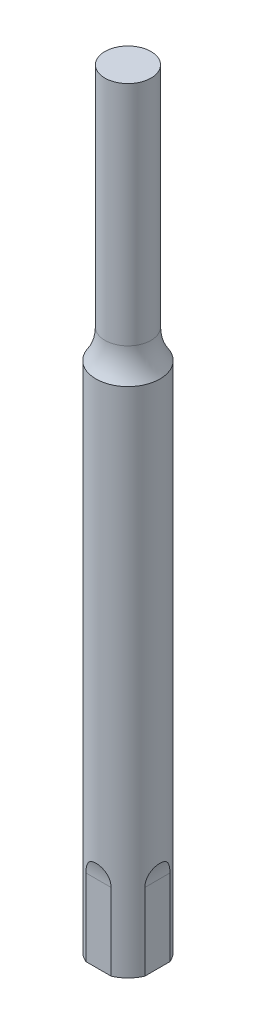
ISO-10303-21;
HEADER;
FILE_DESCRIPTION(('STEP AP214'),'2;1');
FILE_NAME('part.step','',(''),(''),'','','');
FILE_SCHEMA(('AUTOMOTIVE_DESIGN { 1 0 10303 214 1 1 1 1 }'));
ENDSEC;
DATA;
#1=APPLICATION_CONTEXT('core data for automotive mechanical design processes');
#2=APPLICATION_PROTOCOL_DEFINITION('international standard','automotive_design',2000,#1);
#3=PRODUCT_CONTEXT('',#1,'mechanical');
#4=PRODUCT('Part','Part','',(#3));
#5=PRODUCT_RELATED_PRODUCT_CATEGORY('part','',(#4));
#6=PRODUCT_DEFINITION_FORMATION('','',#4);
#7=PRODUCT_DEFINITION_CONTEXT('part definition',#1,'design');
#8=PRODUCT_DEFINITION('design','',#6,#7);
#9=PRODUCT_DEFINITION_SHAPE('','',#8);
#10=(LENGTH_UNIT() NAMED_UNIT(*) SI_UNIT(.MILLI.,.METRE.));
#11=(NAMED_UNIT(*) PLANE_ANGLE_UNIT() SI_UNIT($,.RADIAN.));
#12=(NAMED_UNIT(*) SI_UNIT($,.STERADIAN.) SOLID_ANGLE_UNIT());
#13=UNCERTAINTY_MEASURE_WITH_UNIT(LENGTH_MEASURE(1.E-05),#10,'distance_accuracy_value','');
#14=(GEOMETRIC_REPRESENTATION_CONTEXT(3) GLOBAL_UNCERTAINTY_ASSIGNED_CONTEXT((#13)) GLOBAL_UNIT_ASSIGNED_CONTEXT((#10,
#11,#12)) REPRESENTATION_CONTEXT('',''));
#15=CARTESIAN_POINT('',(0.,0.,0.));
#16=DIRECTION('',(0.,0.,1.));
#17=DIRECTION('',(1.,0.,0.));
#18=AXIS2_PLACEMENT_3D('',#15,#16,#17);
#19=CARTESIAN_POINT('',(-2.77555756156289E-13,25.3999999999999,1.22124532708767E-12));
#20=DIRECTION('',(0.,-1.,0.));
#21=DIRECTION('',(0.,0.,-0.999999999999996));
#22=AXIS2_PLACEMENT_3D('',#19,#20,#21);
#23=CYLINDRICAL_SURFACE('',#22,6.35);
#24=CARTESIAN_POINT('',(1.66533453693773E-13,101.6,5.55111512312578E-13));
#25=DIRECTION('',(0.,1.,0.));
#26=DIRECTION('',(0.,0.,0.999999999999996));
#27=AXIS2_PLACEMENT_3D('',#24,#25,#26);
#28=CIRCLE('',#27,6.35);
#29=CARTESIAN_POINT('',(1.74993353141417E-13,101.6,6.35000000000053));
#30=VERTEX_POINT('',#29);
#31=EDGE_CURVE('E255',#30,#30,#28,.T.);
#32=ORIENTED_EDGE('',*,*,#31,.F.);
#33=EDGE_LOOP('',(#32));
#34=FACE_BOUND('',#33,.T.);
#35=DIRECTION('',(0.,-1.,0.));
#36=VECTOR('',#35,1.);
#37=CARTESIAN_POINT('',(-2.48868157866733,25.4000000000003,5.84200000000018));
#38=LINE('',#37,#36);
#39=CARTESIAN_POINT('',(-2.48868157866788,15.2399999999999,5.84200000000024));
#40=VERTEX_POINT('',#39);
#41=CARTESIAN_POINT('',(-2.48868157866738,1.33226762955019E-12,5.84200000000001));
#42=VERTEX_POINT('',#41);
#43=EDGE_CURVE('E88',#40,#42,#38,.T.);
#44=ORIENTED_EDGE('',*,*,#43,.F.);
#45=CARTESIAN_POINT('',(-2.48868157866788,15.2399999999999,5.84200000000024));
#46=CARTESIAN_POINT('',(-2.48866649988498,15.3457889857967,5.84198674564329));
#47=CARTESIAN_POINT('',(-2.48480209743883,15.451583481686,5.84365199971176));
#48=CARTESIAN_POINT('',(-2.4692624925921,15.6625661090655,5.85024573056988));
#49=CARTESIAN_POINT('',(-2.45758196095423,15.7677537774163,5.85517643380288));
#50=CARTESIAN_POINT('',(-2.42619719220492,15.9774303525066,5.86824887740856));
#51=CARTESIAN_POINT('',(-2.40644189644639,16.0819104304797,5.87641104056255));
#52=CARTESIAN_POINT('',(-2.35871775480615,16.2886437436509,5.89572782641708));
#53=CARTESIAN_POINT('',(-2.33075148869578,16.3908976674528,5.90688150912921));
#54=CARTESIAN_POINT('',(-2.24414165174017,16.6618089201895,5.94052232885252));
#55=CARTESIAN_POINT('',(-2.17763054751576,16.8277430102093,5.96552694836217));
#56=CARTESIAN_POINT('',(-2.01917310908614,17.1455636394776,6.02100045765592));
#57=CARTESIAN_POINT('',(-1.92730427323501,17.297491127998,6.05145260048027));
#58=CARTESIAN_POINT('',(-1.73846869069229,17.5526032765015,6.10801381643529));
#59=CARTESIAN_POINT('',(-1.64631844124591,17.6594232319145,6.13375042506387));
#60=CARTESIAN_POINT('',(-1.44532250991819,17.8566087469755,6.18419405540844));
#61=CARTESIAN_POINT('',(-1.33647170424087,17.9469692381229,6.20890075817685));
#62=CARTESIAN_POINT('',(-1.10244283326204,18.1075937007813,6.25471415599741));
#63=CARTESIAN_POINT('',(-0.977120091207379,18.177659530619,6.2757845947355));
#64=CARTESIAN_POINT('',(-0.714466566561281,18.2920222831637,6.3110551764083));
#65=CARTESIAN_POINT('',(-0.577169647421802,18.3363893277374,6.32527399669824));
#66=CARTESIAN_POINT('',(-0.365047336462703,18.3816297526981,6.3399096937253));
#67=CARTESIAN_POINT('',(-0.292588323829377,18.3931625022224,6.34367556077323));
#68=CARTESIAN_POINT('',(-0.146766320862614,18.4085800552677,6.34872245914681));
#69=CARTESIAN_POINT('',(-0.0734033149568204,18.4124647268557,6.35000344760708));
#70=CARTESIAN_POINT('',(0.12298219210535,18.4124493600617,6.34999422377157));
#71=CARTESIAN_POINT('',(0.246077534505011,18.4015190722466,6.34638294667004));
#72=CARTESIAN_POINT('',(0.488166009263971,18.3584008615264,6.33237435009846));
#73=CARTESIAN_POINT('',(0.607152960335633,18.326182260503,6.32196723755405));
#74=CARTESIAN_POINT('',(0.836784928660823,18.2424760644843,6.29568086091787));
#75=CARTESIAN_POINT('',(0.947466758864873,18.1910803806302,6.279827726594));
#76=CARTESIAN_POINT('',(1.15858055849843,18.071497246319,6.2443315146345));
#77=CARTESIAN_POINT('',(1.25901208408042,18.0033090691675,6.22468827299015));
#78=CARTESIAN_POINT('',(1.45117019317083,17.8504979521347,6.18276603598212));
#79=CARTESIAN_POINT('',(1.54252063042012,17.7654231332478,6.16042329328739));
#80=CARTESIAN_POINT('',(1.71211985992509,17.5832336323703,6.11546018976194));
#81=CARTESIAN_POINT('',(1.79036521986521,17.4861158077835,6.09283975786215));
#82=CARTESIAN_POINT('',(1.94740184147904,17.2630311778878,6.04467681907744));
#83=CARTESIAN_POINT('',(2.02346477176856,17.1350910656538,6.01939715355939));
#84=CARTESIAN_POINT('',(2.15766681698913,16.8694487126229,5.97260595806401));
#85=CARTESIAN_POINT('',(2.21578622165004,16.7317359396344,5.95109858291896));
#86=CARTESIAN_POINT('',(2.3253775580755,16.4197379410274,5.9092542969874));
#87=CARTESIAN_POINT('',(2.37283650087017,16.2438828725406,5.89012939202487));
#88=CARTESIAN_POINT('',(2.44382713999507,15.8868305442788,5.86103018406271));
#89=CARTESIAN_POINT('',(2.4673782958792,15.7056377529245,5.85104843970737));
#90=CARTESIAN_POINT('',(2.48247124353283,15.4764800511201,5.84464146932841));
#91=CARTESIAN_POINT('',(2.48480264626246,15.4291810709971,5.84365072446737));
#92=CARTESIAN_POINT('',(2.48790634262063,15.3345920509215,5.84233084738727));
#93=CARTESIAN_POINT('',(2.48868091343701,15.287302099227,5.84200074883971));
#94=CARTESIAN_POINT('',(2.48868157866772,15.2399999999986,5.84199999999924));
#95=B_SPLINE_CURVE_WITH_KNOTS('',3,(#45,#46,#47,#48,#49,#50,#51,#52,#53,#54,#55,#56,#57,#58,#59,
#60,#61,#62,#63,#64,#65,#66,#67,#68,#69,#70,#71,#72,#73,#74,#75,#76,#77,#78,#79,#80,#81,#82,#83,
#84,#85,#86,#87,#88,#89,#90,#91,#92,#93,#94),.UNSPECIFIED.,.F.,.F.,(4,2,2,2,2,2,2,2,2,2,2,2,2,2,
2,2,2,2,2,2,2,2,2,2,4),(0.,0.31729123803635,0.634799034106182,0.954346354791918,
1.27379338544631,1.81305221669973,2.35068087184189,2.77922420047607,3.20789927177127,
3.64062847085766,4.07217129153239,4.29218369195257,4.51219988766061,4.88082185061518,
5.24997618851107,5.61738352157905,5.98480675697532,6.36385967746534,6.74301171996676,
7.19429865145368,7.64607955480851,8.19351675556645,8.74050801601374,8.8825904382044,
9.02446488385635),.UNSPECIFIED.);
#96=CARTESIAN_POINT('',(2.48868157866772,15.2399999999986,5.84199999999924));
#97=VERTEX_POINT('',#96);
#98=EDGE_CURVE('E64',#40,#97,#95,.T.);
#99=ORIENTED_EDGE('',*,*,#98,.T.);
#100=DIRECTION('',(0.,-1.,0.));
#101=VECTOR('',#100,1.);
#102=CARTESIAN_POINT('',(2.48868157866744,25.4000000000003,5.84200000000168));
#103=LINE('',#102,#101);
#104=CARTESIAN_POINT('',(2.48868157866766,1.77635683940025E-12,5.84200000000035));
#105=VERTEX_POINT('',#104);
#106=EDGE_CURVE('E123',#105,#97,#103,.F.);
#107=ORIENTED_EDGE('',*,*,#106,.F.);
#108=CARTESIAN_POINT('',(0.,0.,0.));
#109=DIRECTION('',(0.,1.,0.));
#110=DIRECTION('',(0.,0.,0.999999999999996));
#111=AXIS2_PLACEMENT_3D('',#108,#109,#110);
#112=CIRCLE('',#111,6.35);
#113=CARTESIAN_POINT('',(5.84199999999968,0.,2.48868157866788));
#114=VERTEX_POINT('',#113);
#115=EDGE_CURVE('E134',#105,#114,#112,.T.);
#116=ORIENTED_EDGE('',*,*,#115,.T.);
#117=DIRECTION('',(0.,-1.,0.));
#118=VECTOR('',#117,1.);
#119=CARTESIAN_POINT('',(5.84199999999913,25.3999999999976,2.48868157866805));
#120=LINE('',#119,#118);
#121=CARTESIAN_POINT('',(5.84199999999974,15.2400000000026,2.48868157866866));
#122=VERTEX_POINT('',#121);
#123=EDGE_CURVE('E153',#114,#122,#120,.F.);
#124=ORIENTED_EDGE('',*,*,#123,.T.);
#125=CARTESIAN_POINT('',(5.84199999999974,15.2400000000026,2.48868157866866));
#126=CARTESIAN_POINT('',(5.84198674564357,15.3457889857988,2.48866649988238));
#127=CARTESIAN_POINT('',(5.8436519997123,15.4515834816877,2.48480209743509));
#128=CARTESIAN_POINT('',(5.8502457305706,15.6625661090669,2.46926249258765));
#129=CARTESIAN_POINT('',(5.85517643380351,15.7677537774179,2.45758196095017));
#130=CARTESIAN_POINT('',(5.86824887740929,15.9774303525079,2.42619719220035));
#131=CARTESIAN_POINT('',(5.87641104056346,16.0819104304805,2.40644189644093));
#132=CARTESIAN_POINT('',(5.89572782641754,16.2886437436517,2.35871775480266));
#133=CARTESIAN_POINT('',(5.90688150912905,16.390897667454,2.33075148869517));
#134=CARTESIAN_POINT('',(5.94052232885177,16.6618089201899,2.24414165174143));
#135=CARTESIAN_POINT('',(5.96552694836219,16.8277430102068,2.17763054751196));
#136=CARTESIAN_POINT('',(6.0210004576563,17.145563639475,2.01917310908207));
#137=CARTESIAN_POINT('',(6.05145260048025,17.297491127998,1.92730427323567));
#138=CARTESIAN_POINT('',(6.10801381643478,17.5526032764994,1.73846869069222));
#139=CARTESIAN_POINT('',(6.13375042506323,17.659423231909,1.64631844124216));
#140=CARTESIAN_POINT('',(6.18419405540823,17.8566087469724,1.44532250991521));
#141=CARTESIAN_POINT('',(6.20890075817718,17.9469692381256,1.33647170424234));
#142=CARTESIAN_POINT('',(6.25471415599718,18.1075937007822,1.10244283326403));
#143=CARTESIAN_POINT('',(6.27578459473417,18.1776595306122,0.977120091205361));
#144=CARTESIAN_POINT('',(6.31105517640754,18.2920222831592,0.714466566558347));
#145=CARTESIAN_POINT('',(6.32527399669916,18.3363893277427,0.577169647421946));
#146=CARTESIAN_POINT('',(6.33990969372498,18.3816297526973,0.365047336462967));
#147=CARTESIAN_POINT('',(6.34367556077185,18.393162502216,0.292588323829076));
#148=CARTESIAN_POINT('',(6.34872245914527,18.4085800552608,0.146766320862424));
#149=CARTESIAN_POINT('',(6.35000344760645,18.4124647268538,0.0734033149573053));
#150=CARTESIAN_POINT('',(6.34999422377172,18.4124493600637,-0.122982192103601));
#151=CARTESIAN_POINT('',(6.3463829466689,18.4015190722407,-0.246077534502664));
#152=CARTESIAN_POINT('',(6.3323743500967,18.3584008615191,-0.488166009262574));
#153=CARTESIAN_POINT('',(6.32196723755295,18.3261822605022,-0.607152960335789));
#154=CARTESIAN_POINT('',(6.2956808609172,18.2424760644842,-0.83678492865987));
#155=CARTESIAN_POINT('',(6.2798277265931,18.1910803806245,-0.94746675886128));
#156=CARTESIAN_POINT('',(6.2443315146332,18.0714972463126,-1.15858055849537));
#157=CARTESIAN_POINT('',(6.22468827298868,18.0033090691662,-1.25901208408053));
#158=CARTESIAN_POINT('',(6.18276603598082,17.8504979521343,-1.45117019317037));
#159=CARTESIAN_POINT('',(6.16042329328645,17.765423133243,-1.5425206304157));
#160=CARTESIAN_POINT('',(6.11546018976165,17.5832336323647,-1.71211985992093));
#161=CARTESIAN_POINT('',(6.09283975786216,17.4861158077815,-1.79036521986529));
#162=CARTESIAN_POINT('',(6.04467681907774,17.2630311778875,-1.94740184147937));
#163=CARTESIAN_POINT('',(6.01939715355962,17.1350910656507,-2.02346477176326));
#164=CARTESIAN_POINT('',(5.97260595806393,16.8694487126197,-2.15766681698349));
#165=CARTESIAN_POINT('',(5.95109858291865,16.7317359396339,-2.21578622164969));
#166=CARTESIAN_POINT('',(5.90925429698785,16.4197379410286,-2.32537755807543));
#167=CARTESIAN_POINT('',(5.8901293920266,16.24388287254,-2.37283650086259));
#168=CARTESIAN_POINT('',(5.86103018406203,15.8868305442778,-2.44382713999087));
#169=CARTESIAN_POINT('',(5.851048439703,15.7056377529251,-2.4673782958859));
#170=CARTESIAN_POINT('',(5.84464146932724,15.4764800511203,-2.48247124353096));
#171=CARTESIAN_POINT('',(5.84365072446727,15.4291810709971,-2.48480264625763));
#172=CARTESIAN_POINT('',(5.84233084738848,15.3345920509211,-2.4879063426139));
#173=CARTESIAN_POINT('',(5.84200074884115,15.2873020992264,-2.48868091343133));
#174=CARTESIAN_POINT('',(5.84199999999963,15.2399999999981,-2.48868157866827));
#175=B_SPLINE_CURVE_WITH_KNOTS('',3,(#125,#126,#127,#128,#129,#130,#131,#132,#133,#134,#135,
#136,#137,#138,#139,#140,#141,#142,#143,#144,#145,#146,#147,#148,#149,#150,#151,#152,#153,#154,
#155,#156,#157,#158,#159,#160,#161,#162,#163,#164,#165,#166,#167,#168,#169,#170,#171,#172,#173,
#174),.UNSPECIFIED.,.F.,.F.,(4,2,2,2,2,2,2,2,2,2,2,2,2,2,2,2,2,2,2,2,2,2,2,2,4),(0.,
0.317291238035162,0.634799034105319,0.954346354790464,1.27379338544348,1.81305221669528,
2.3506808718362,2.77922420047062,3.20789927176581,3.6406284708521,4.07217129152672,
4.29218369194581,4.51219988765279,4.88082185060726,5.2499761885029,5.61738352157056,
5.98480675696665,6.36385967745644,6.7430117199576,7.19429865144318,7.64607955479672,
8.19351675555435,8.74050801600128,8.88259043819227,9.02446488384455),.UNSPECIFIED.);
#176=CARTESIAN_POINT('',(5.84199999999963,15.2399999999981,-2.48868157866827));
#177=VERTEX_POINT('',#176);
#178=EDGE_CURVE('E131',#122,#177,#175,.T.);
#179=ORIENTED_EDGE('',*,*,#178,.T.);
#180=DIRECTION('',(0.,-1.,0.));
#181=VECTOR('',#180,1.);
#182=CARTESIAN_POINT('',(5.84200000000012,25.400000000003,-2.48868157866716));
#183=LINE('',#182,#181);
#184=CARTESIAN_POINT('',(5.84199999999957,1.77635683940025E-12,-2.48868157866644));
#185=VERTEX_POINT('',#184);
#186=EDGE_CURVE('E146',#177,#185,#183,.T.);
#187=ORIENTED_EDGE('',*,*,#186,.T.);
#188=CARTESIAN_POINT('',(2.48868157866777,8.88178419700125E-13,-5.8419999999994));
#189=VERTEX_POINT('',#188);
#190=EDGE_CURVE('E152',#185,#189,#112,.T.);
#191=ORIENTED_EDGE('',*,*,#190,.T.);
#192=DIRECTION('',(0.,-1.,0.));
#193=VECTOR('',#192,1.);
#194=CARTESIAN_POINT('',(2.48868157866733,25.4000000000003,-5.84200000000018));
#195=LINE('',#194,#193);
#196=CARTESIAN_POINT('',(2.48868157866772,15.239999999999,-5.84200000000046));
#197=VERTEX_POINT('',#196);
#198=EDGE_CURVE('E253',#189,#197,#195,.F.);
#199=ORIENTED_EDGE('',*,*,#198,.T.);
#200=CARTESIAN_POINT('',(2.48868157866772,15.239999999999,-5.84200000000046));
#201=CARTESIAN_POINT('',(2.48866649987974,15.3457889857948,-5.8419867456437));
#202=CARTESIAN_POINT('',(2.48480209743192,15.4515834816834,-5.84365199971221));
#203=CARTESIAN_POINT('',(2.46926249258425,15.6625661090625,-5.85024573057032));
#204=CARTESIAN_POINT('',(2.45758196094706,15.7677537774134,-5.85517643380329));
#205=CARTESIAN_POINT('',(2.42619719219712,15.9774303525038,-5.86824887740902));
#206=CARTESIAN_POINT('',(2.40644189643727,16.0819104304767,-5.87641104056311));
#207=CARTESIAN_POINT('',(2.3587177547998,16.2886437436487,-5.89572782641744));
#208=CARTESIAN_POINT('',(2.33075148869357,16.3908976674517,-5.90688150912927));
#209=CARTESIAN_POINT('',(2.24414165173978,16.6618089201884,-5.9405223288525));
#210=CARTESIAN_POINT('',(2.17763054750673,16.8277430102046,-5.96552694836282));
#211=CARTESIAN_POINT('',(2.01917310907795,17.1455636394761,-6.02100045765602));
#212=CARTESIAN_POINT('',(1.92730427323626,17.2974911280033,-6.05145260047915));
#213=CARTESIAN_POINT('',(1.7384686906914,17.5526032765023,-6.10801381643407));
#214=CARTESIAN_POINT('',(1.64631844123747,17.6594232319074,-6.13375042506331));
#215=CARTESIAN_POINT('',(1.44532250990987,17.8566087469701,-6.18419405540803));
#216=CARTESIAN_POINT('',(1.33647170424021,17.9469692381271,-6.20890075817592));
#217=CARTESIAN_POINT('',(1.10244283326276,18.1075937007817,-6.25471415599547));
#218=CARTESIAN_POINT('',(0.977120091201663,18.1776595306058,-6.27578459473308));
#219=CARTESIAN_POINT('',(0.71446656655547,18.2920222831574,-6.31105517640724));
#220=CARTESIAN_POINT('',(0.577169647422317,18.3363893277515,-6.32527399669904));
#221=CARTESIAN_POINT('',(0.365047336463171,18.3816297526989,-6.33990969372439));
#222=CARTESIAN_POINT('',(0.292588323828208,18.3931625022112,-6.34367556077097));
#223=CARTESIAN_POINT('',(0.146766320860773,18.4085800552561,-6.34872245914425));
#224=CARTESIAN_POINT('',(0.0734033149559442,18.4124647268558,-6.35000344760556));
#225=CARTESIAN_POINT('',(-0.122982192104064,18.412449360071,-6.34999422377098));
#226=CARTESIAN_POINT('',(-0.246077534502588,18.4015190722381,-6.34638294666803));
#227=CARTESIAN_POINT('',(-0.488166009263142,18.3584008615125,-6.33237435009583));
#228=CARTESIAN_POINT('',(-0.607152960337541,18.3261822605014,-6.32196723755221));
#229=CARTESIAN_POINT('',(-0.836784928660969,18.2424760644851,-6.29568086091651));
#230=CARTESIAN_POINT('',(-0.947466758860566,18.1910803806212,-6.27982772659234));
#231=CARTESIAN_POINT('',(-1.15858055849461,18.0714972463084,-6.24433151463284));
#232=CARTESIAN_POINT('',(-1.25901208408154,18.0033090691651,-6.22468827298877));
#233=CARTESIAN_POINT('',(-1.45117019317122,17.8504979521344,-6.18276603598116));
#234=CARTESIAN_POINT('',(-1.54252063041448,17.765423133241,-6.16042329328655));
#235=CARTESIAN_POINT('',(-1.71211985991921,17.583233632362,-6.11546018976125));
#236=CARTESIAN_POINT('',(-1.79036521986512,17.4861158077802,-6.09283975786148));
#237=CARTESIAN_POINT('',(-1.94740184147929,17.2630311778875,-6.04467681907741));
#238=CARTESIAN_POINT('',(-2.0234647717612,17.1350910656499,-6.01939715356008));
#239=CARTESIAN_POINT('',(-2.15766681698176,16.86944871262,-5.97260595806396));
#240=CARTESIAN_POINT('',(-2.21578622165027,16.7317359396361,-5.95109858291747));
#241=CARTESIAN_POINT('',(-2.32537755807661,16.4197379410321,-5.90925429698623));
#242=CARTESIAN_POINT('',(-2.37283650086092,16.2438828725423,-5.89012939202628));
#243=CARTESIAN_POINT('',(-2.44382713998982,15.8868305442794,-5.86103018406282));
#244=CARTESIAN_POINT('',(-2.46737829588829,15.7056377529271,-5.8510484397036));
#245=CARTESIAN_POINT('',(-2.48247124353149,15.4764800511226,-5.84464146932738));
#246=CARTESIAN_POINT('',(-2.48480264625743,15.4291810709999,-5.84365072446731));
#247=CARTESIAN_POINT('',(-2.48790634261282,15.3345920509249,-5.84233084738839));
#248=CARTESIAN_POINT('',(-2.4886809134301,15.2873020992307,-5.84200074884105));
#249=CARTESIAN_POINT('',(-2.48868157866777,15.240000000003,-5.84199999999963));
#250=B_SPLINE_CURVE_WITH_KNOTS('',3,(#200,#201,#202,#203,#204,#205,#206,#207,#208,#209,#210,
#211,#212,#213,#214,#215,#216,#217,#218,#219,#220,#221,#222,#223,#224,#225,#226,#227,#228,#229,
#230,#231,#232,#233,#234,#235,#236,#237,#238,#239,#240,#241,#242,#243,#244,#245,#246,#247,#248,
#249),.UNSPECIFIED.,.F.,.F.,(4,2,2,2,2,2,2,2,2,2,2,2,2,2,2,2,2,2,2,2,2,2,2,2,4),(0.,
0.317291238034279,0.634799034104446,0.954346354790776,1.27379338544444,1.81305221669907,
2.35068087184175,2.77922420047427,3.20789927176828,3.64062847085404,4.07217129152752,
4.29218369194688,4.51219988765418,4.88082185060851,5.2499761885042,5.61738352157143,
5.98480675696685,6.36385967745627,6.7430117199573,7.19429865144125,7.64607955479296,
8.19351675555096,8.74050801599839,8.88259043818781,9.02446488383849),.UNSPECIFIED.);
#251=CARTESIAN_POINT('',(-2.48868157866777,15.240000000003,-5.84199999999963));
#252=VERTEX_POINT('',#251);
#253=EDGE_CURVE('E81',#197,#252,#250,.T.);
#254=ORIENTED_EDGE('',*,*,#253,.T.);
#255=DIRECTION('',(0.,-1.,0.));
#256=VECTOR('',#255,1.);
#257=CARTESIAN_POINT('',(-2.48868157866799,25.4000000000021,-5.8419999999994));
#258=LINE('',#257,#256);
#259=CARTESIAN_POINT('',(-2.48868157866744,2.66453525910038E-12,-5.84199999999974));
#260=VERTEX_POINT('',#259);
#261=EDGE_CURVE('E252',#252,#260,#258,.T.);
#262=ORIENTED_EDGE('',*,*,#261,.T.);
#263=CARTESIAN_POINT('',(-5.84199999999979,8.88178419700125E-13,-2.48868157866805));
#264=VERTEX_POINT('',#263);
#265=EDGE_CURVE('E148',#260,#264,#112,.T.);
#266=ORIENTED_EDGE('',*,*,#265,.T.);
#267=DIRECTION('',(0.,-1.,0.));
#268=VECTOR('',#267,1.);
#269=CARTESIAN_POINT('',(-5.84200000000046,25.4000000000008,-2.48868157866783));
#270=LINE('',#269,#268);
#271=CARTESIAN_POINT('',(-5.84200000000057,15.2400000000017,-2.48868157866738));
#272=VERTEX_POINT('',#271);
#273=EDGE_CURVE('E260',#264,#272,#270,.F.);
#274=ORIENTED_EDGE('',*,*,#273,.T.);
#275=CARTESIAN_POINT('',(-5.84200000000057,15.2400000000017,-2.48868157866738));
#276=CARTESIAN_POINT('',(-5.84198674564382,15.3457889857977,-2.48866649988129));
#277=CARTESIAN_POINT('',(-5.84365199971231,15.4515834816865,-2.48480209743412));
#278=CARTESIAN_POINT('',(-5.85024573057042,15.6625661090657,-2.4692624925868));
#279=CARTESIAN_POINT('',(-5.85517643380341,15.7677537774166,-2.4575819609493));
#280=CARTESIAN_POINT('',(-5.8682488774093,15.9774303525069,-2.42619719219927));
#281=CARTESIAN_POINT('',(-5.87641104056353,16.0819104304798,-2.40644189643963));
#282=CARTESIAN_POINT('',(-5.89572782641758,16.2886437436516,-2.35871775480162));
#283=CARTESIAN_POINT('',(-5.906881509129,16.3908976674543,-2.3307514886946));
#284=CARTESIAN_POINT('',(-5.94052232885174,16.6618089201908,-2.24414165174055));
#285=CARTESIAN_POINT('',(-5.96552694836244,16.8277430102074,-2.17763054750924));
#286=CARTESIAN_POINT('',(-6.02100045765709,17.1455636394773,-2.01917310908018));
#287=CARTESIAN_POINT('',(-6.0514526004813,17.2974911280024,-1.92730427323649));
#288=CARTESIAN_POINT('',(-6.10801381643571,17.5526032765026,-1.73846869069249));
#289=CARTESIAN_POINT('',(-6.13375042506389,17.6594232319099,-1.64631844124045));
#290=CARTESIAN_POINT('',(-6.18419405540855,17.8566087469718,-1.44532250991264));
#291=CARTESIAN_POINT('',(-6.20890075817745,17.9469692381258,-1.33647170424088));
#292=CARTESIAN_POINT('',(-6.25471415599753,18.1075937007822,-1.10244283326302));
#293=CARTESIAN_POINT('',(-6.27578459473463,18.177659530611,-0.977120091203621));
#294=CARTESIAN_POINT('',(-6.311055176408,18.2920222831596,-0.71446656655674));
#295=CARTESIAN_POINT('',(-6.32527399669951,18.336389327746,-0.577169647421217));
#296=CARTESIAN_POINT('',(-6.33990969372538,18.381629752699,-0.365047336462318));
#297=CARTESIAN_POINT('',(-6.3436755607723,18.3931625022161,-0.292588323828274));
#298=CARTESIAN_POINT('',(-6.34872245914583,18.4085800552601,-0.146766320861594));
#299=CARTESIAN_POINT('',(-6.35000344760707,18.4124647268539,-0.0734033149566001));
#300=CARTESIAN_POINT('',(-6.34999422377247,18.4124493600647,0.122982192104393));
#301=CARTESIAN_POINT('',(-6.3463829466697,18.4015190722408,0.246077534503721));
#302=CARTESIAN_POINT('',(-6.33237435009716,18.3584008615191,0.488166009264172));
#303=CARTESIAN_POINT('',(-6.32196723755303,18.3261822605029,0.607152960337666));
#304=CARTESIAN_POINT('',(-6.29568086091737,18.2424760644853,0.83678492866185));
#305=CARTESIAN_POINT('',(-6.27982772659374,18.1910803806252,0.947466758863102));
#306=CARTESIAN_POINT('',(-6.24433151463395,18.0714972463129,1.15858055849681));
#307=CARTESIAN_POINT('',(-6.22468827298905,18.0033090691664,1.25901208408174));
#308=CARTESIAN_POINT('',(-6.18276603598125,17.8504979521351,1.45117019317171));
#309=CARTESIAN_POINT('',(-6.16042329328736,17.7654231332443,1.54252063041744));
#310=CARTESIAN_POINT('',(-6.11546018976236,17.5832336323664,1.71211985992223));
#311=CARTESIAN_POINT('',(-6.0928397578622,17.486115807783,1.79036521986573));
#312=CARTESIAN_POINT('',(-6.04467681907763,17.2630311778894,1.94740184147998));
#313=CARTESIAN_POINT('',(-6.0193971535603,17.1350910656531,2.02346477176522));
#314=CARTESIAN_POINT('',(-5.9726059580647,16.8694487126223,2.15766681698549));
#315=CARTESIAN_POINT('',(-5.95109858291874,16.7317359396361,2.21578622165037));
#316=CARTESIAN_POINT('',(-5.90925429698727,16.4197379410301,2.32537755807722));
#317=CARTESIAN_POINT('',(-5.89012939202627,16.2438828725411,2.37283650086751));
#318=CARTESIAN_POINT('',(-5.86103018406254,15.8868305442772,2.44382713999316));
#319=CARTESIAN_POINT('',(-5.8510484397041,15.7056377529231,2.46737829588243));
#320=CARTESIAN_POINT('',(-5.84464146932748,15.4764800511187,2.48247124353269));
#321=CARTESIAN_POINT('',(-5.84365072446726,15.4291810709966,2.48480264626108));
#322=CARTESIAN_POINT('',(-5.84233084738836,15.3345920509227,2.48790634261833));
#323=CARTESIAN_POINT('',(-5.84200074884119,15.287302099229,2.48868091343504));
#324=CARTESIAN_POINT('',(-5.84200000000035,15.2400000000017,2.48868157866811));
#325=B_SPLINE_CURVE_WITH_KNOTS('',3,(#275,#276,#277,#278,#279,#280,#281,#282,#283,#284,#285,
#286,#287,#288,#289,#290,#291,#292,#293,#294,#295,#296,#297,#298,#299,#300,#301,#302,#303,#304,
#305,#306,#307,#308,#309,#310,#311,#312,#313,#314,#315,#316,#317,#318,#319,#320,#321,#322,#323,
#324),.UNSPECIFIED.,.F.,.F.,(4,2,2,2,2,2,2,2,2,2,2,2,2,2,2,2,2,2,2,2,2,2,2,2,4),(0.,
0.31729123803476,0.634799034104906,0.954346354790969,1.27379338544464,1.81305221669815,
2.35068087183988,2.77922420047276,3.20789927176713,3.64062847085393,4.0721712915283,
4.29218369194706,4.51219988765391,4.88082185060919,5.2499761885053,5.61738352157262,
5.98480675696858,6.36385967745774,6.74301171995816,7.19429865144375,7.64607955479735,
8.19351675555751,8.74050801600693,8.88259043819486,9.02446488384409),.UNSPECIFIED.);
#326=CARTESIAN_POINT('',(-5.84200000000035,15.2400000000017,2.48868157866811));
#327=VERTEX_POINT('',#326);
#328=EDGE_CURVE('E185',#272,#327,#325,.T.);
#329=ORIENTED_EDGE('',*,*,#328,.T.);
#330=DIRECTION('',(0.,-1.,0.));
#331=VECTOR('',#330,1.);
#332=CARTESIAN_POINT('',(-5.84200000000024,25.3999999999999,2.48868157866833));
#333=LINE('',#332,#331);
#334=CARTESIAN_POINT('',(-5.84200000000012,3.10862446895044E-12,2.48868157866799));
#335=VERTEX_POINT('',#334);
#336=EDGE_CURVE('E268',#327,#335,#333,.T.);
#337=ORIENTED_EDGE('',*,*,#336,.T.);
#338=EDGE_CURVE('E145',#335,#42,#112,.T.);
#339=ORIENTED_EDGE('',*,*,#338,.T.);
#340=EDGE_LOOP('',(#44,#99,#107,#116,#124,#179,#187,#191,#199,#254,#262,#266,#274,#329,#337,#339));
#341=FACE_BOUND('',#340,.T.);
#342=ADVANCED_FACE('F54',(#34,#341),#23,.T.);
#343=CARTESIAN_POINT('',(0.,0.,0.));
#344=DIRECTION('',(0.,1.,0.));
#345=DIRECTION('',(0.,0.,0.999999999999996));
#346=AXIS2_PLACEMENT_3D('',#343,#344,#345);
#347=PLANE('',#346);
#348=DIRECTION('',(0.999999999999999,0.,0.));
#349=VECTOR('',#348,1.);
#350=CARTESIAN_POINT('',(-1.11022302462516E-13,3.10862446895044E-12,5.84199999999979));
#351=LINE('',#350,#349);
#352=EDGE_CURVE('E121',#42,#105,#351,.T.);
#353=ORIENTED_EDGE('',*,*,#352,.F.);
#354=ORIENTED_EDGE('',*,*,#338,.F.);
#355=DIRECTION('',(0.,0.,-0.999999999999996));
#356=VECTOR('',#355,1.);
#357=CARTESIAN_POINT('',(-5.84200000000057,8.88178419700125E-13,2.22044604925031E-13));
#358=LINE('',#357,#356);
#359=EDGE_CURVE('E163',#335,#264,#358,.T.);
#360=ORIENTED_EDGE('',*,*,#359,.T.);
#361=ORIENTED_EDGE('',*,*,#265,.F.);
#362=DIRECTION('',(0.999999999999999,0.,0.));
#363=VECTOR('',#362,1.);
#364=CARTESIAN_POINT('',(1.11022302462516E-13,1.33226762955019E-12,-5.84199999999901));
#365=LINE('',#364,#363);
#366=EDGE_CURVE('E171',#260,#189,#365,.T.);
#367=ORIENTED_EDGE('',*,*,#366,.T.);
#368=ORIENTED_EDGE('',*,*,#190,.F.);
#369=DIRECTION('',(0.,0.,0.999999999999996));
#370=VECTOR('',#369,1.);
#371=CARTESIAN_POINT('',(5.84199999999935,-1.77635683940025E-12,-6.10622663543836E-13));
#372=LINE('',#371,#370);
#373=EDGE_CURVE('E143',#185,#114,#372,.T.);
#374=ORIENTED_EDGE('',*,*,#373,.T.);
#375=ORIENTED_EDGE('',*,*,#115,.F.);
#376=EDGE_LOOP('',(#353,#354,#360,#361,#367,#368,#374,#375));
#377=FACE_BOUND('',#376,.T.);
#378=ADVANCED_FACE('F140',(#377),#347,.F.);
#379=CARTESIAN_POINT('',(-5.84200000000024,25.4000000000012,5.57676443011357));
#380=DIRECTION('',(0.999999999999999,0.,0.));
#381=DIRECTION('',(0.,0.,-0.999999999999996));
#382=AXIS2_PLACEMENT_3D('',#379,#380,#381);
#383=PLANE('',#382);
#384=ORIENTED_EDGE('',*,*,#336,.F.);
#385=DIRECTION('',(0.,0.,0.999999999999996));
#386=VECTOR('',#385,1.);
#387=CARTESIAN_POINT('',(-5.84200000000057,15.2400000000017,-2.48868157866738));
#388=LINE('',#387,#386);
#389=EDGE_CURVE('E177',#327,#272,#388,.F.);
#390=ORIENTED_EDGE('',*,*,#389,.T.);
#391=ORIENTED_EDGE('',*,*,#273,.F.);
#392=ORIENTED_EDGE('',*,*,#359,.F.);
#393=EDGE_LOOP('',(#384,#390,#391,#392));
#394=FACE_BOUND('',#393,.T.);
#395=ADVANCED_FACE('F280',(#394),#383,.F.);
#396=CARTESIAN_POINT('',(5.84200000000012,25.4000000000008,-5.59654019050121));
#397=DIRECTION('',(-0.999999999999999,0.,0.));
#398=DIRECTION('',(0.,0.,0.999999999999996));
#399=AXIS2_PLACEMENT_3D('',#396,#397,#398);
#400=PLANE('',#399);
#401=ORIENTED_EDGE('',*,*,#186,.F.);
#402=DIRECTION('',(0.,0.,-0.999999999999996));
#403=VECTOR('',#402,1.);
#404=CARTESIAN_POINT('',(5.84199999999974,15.2400000000026,2.48868157866866));
#405=LINE('',#404,#403);
#406=EDGE_CURVE('E181',#177,#122,#405,.F.);
#407=ORIENTED_EDGE('',*,*,#406,.T.);
#408=ORIENTED_EDGE('',*,*,#123,.F.);
#409=ORIENTED_EDGE('',*,*,#373,.F.);
#410=EDGE_LOOP('',(#401,#407,#408,#409));
#411=FACE_BOUND('',#410,.T.);
#412=ADVANCED_FACE('F248',(#411),#400,.F.);
#413=CARTESIAN_POINT('',(5.52398644596763,25.3999999999999,-5.84200000000012));
#414=DIRECTION('',(0.,0.,0.999999999999996));
#415=DIRECTION('',(0.999999999999999,0.,0.));
#416=AXIS2_PLACEMENT_3D('',#413,#414,#415);
#417=PLANE('',#416);
#418=ORIENTED_EDGE('',*,*,#261,.F.);
#419=DIRECTION('',(-0.999999999999999,0.,0.));
#420=VECTOR('',#419,1.);
#421=CARTESIAN_POINT('',(2.48868157866772,15.239999999999,-5.84200000000046));
#422=LINE('',#421,#420);
#423=EDGE_CURVE('E130',#252,#197,#422,.F.);
#424=ORIENTED_EDGE('',*,*,#423,.T.);
#425=ORIENTED_EDGE('',*,*,#198,.F.);
#426=ORIENTED_EDGE('',*,*,#366,.F.);
#427=EDGE_LOOP('',(#418,#424,#425,#426));
#428=FACE_BOUND('',#427,.T.);
#429=ADVANCED_FACE('F205',(#428),#417,.F.);
#430=CARTESIAN_POINT('',(-16.0020000000001,15.240000000003,2.22044604925031E-13));
#431=DIRECTION('',(0.,0.,-0.999999999999996));
#432=DIRECTION('',(-0.999999999999999,0.,0.));
#433=AXIS2_PLACEMENT_3D('',#430,#431,#432);
#434=CYLINDRICAL_SURFACE('',#433,10.16);
#435=ORIENTED_EDGE('',*,*,#328,.F.);
#436=ORIENTED_EDGE('',*,*,#389,.F.);
#437=EDGE_LOOP('',(#435,#436));
#438=FACE_BOUND('',#437,.T.);
#439=ADVANCED_FACE('F201',(#438),#434,.F.);
#440=CARTESIAN_POINT('',(16.0020000000002,15.2400000000052,1.11022302462516E-13));
#441=DIRECTION('',(0.,0.,0.999999999999996));
#442=DIRECTION('',(0.999999999999999,0.,0.));
#443=AXIS2_PLACEMENT_3D('',#440,#441,#442);
#444=CYLINDRICAL_SURFACE('',#443,10.16);
#445=ORIENTED_EDGE('',*,*,#178,.F.);
#446=ORIENTED_EDGE('',*,*,#406,.F.);
#447=EDGE_LOOP('',(#445,#446));
#448=FACE_BOUND('',#447,.T.);
#449=ADVANCED_FACE('F204',(#448),#444,.F.);
#450=CARTESIAN_POINT('',(5.52398644596719,25.4000000000061,5.84200000000057));
#451=DIRECTION('',(0.,0.,0.999999999999996));
#452=DIRECTION('',(0.999999999999999,0.,0.));
#453=AXIS2_PLACEMENT_3D('',#450,#451,#452);
#454=PLANE('',#453);
#455=ORIENTED_EDGE('',*,*,#106,.T.);
#456=DIRECTION('',(-0.999999999999999,0.,0.));
#457=VECTOR('',#456,1.);
#458=CARTESIAN_POINT('',(-2.48868157866788,15.2399999999999,5.84200000000024));
#459=LINE('',#458,#457);
#460=EDGE_CURVE('E223',#97,#40,#459,.T.);
#461=ORIENTED_EDGE('',*,*,#460,.T.);
#462=ORIENTED_EDGE('',*,*,#43,.T.);
#463=ORIENTED_EDGE('',*,*,#352,.T.);
#464=EDGE_LOOP('',(#455,#461,#462,#463));
#465=FACE_BOUND('',#464,.T.);
#466=ADVANCED_FACE('F122',(#465),#454,.T.);
#467=CARTESIAN_POINT('',(2.22044604925031E-13,15.240000000003,-16.0020000000001));
#468=DIRECTION('',(0.999999999999999,0.,0.));
#469=DIRECTION('',(0.,0.,-0.999999999999996));
#470=AXIS2_PLACEMENT_3D('',#467,#468,#469);
#471=CYLINDRICAL_SURFACE('',#470,10.16);
#472=ORIENTED_EDGE('',*,*,#253,.F.);
#473=ORIENTED_EDGE('',*,*,#423,.F.);
#474=EDGE_LOOP('',(#472,#473));
#475=FACE_BOUND('',#474,.T.);
#476=ADVANCED_FACE('F211',(#475),#471,.F.);
#477=CARTESIAN_POINT('',(5.52398644596763,15.2400000000057,16.0019999999996));
#478=DIRECTION('',(0.999999999999999,0.,0.));
#479=DIRECTION('',(0.,0.,-0.999999999999996));
#480=AXIS2_PLACEMENT_3D('',#477,#478,#479);
#481=CYLINDRICAL_SURFACE('',#480,10.16);
#482=ORIENTED_EDGE('',*,*,#460,.F.);
#483=ORIENTED_EDGE('',*,*,#98,.F.);
#484=EDGE_LOOP('',(#482,#483));
#485=FACE_BOUND('',#484,.T.);
#486=ADVANCED_FACE('F214',(#485),#481,.F.);
#487=CARTESIAN_POINT('',(-1.11022302462516E-13,152.400000000001,-6.10622663543836E-13));
#488=DIRECTION('',(0.,-1.,0.));
#489=DIRECTION('',(0.,0.,-0.999999999999996));
#490=AXIS2_PLACEMENT_3D('',#487,#488,#489);
#491=CYLINDRICAL_SURFACE('',#490,4.572);
#492=CARTESIAN_POINT('',(2.22044604925031E-13,107.341748514174,5.55111512312578E-13));
#493=DIRECTION('',(0.,-1.,0.));
#494=DIRECTION('',(0.,0.,-0.999999999999996));
#495=AXIS2_PLACEMENT_3D('',#492,#493,#494);
#496=CIRCLE('',#495,4.572);
#497=CARTESIAN_POINT('',(2.15953477322728E-13,107.341748514174,-4.57199999999942));
#498=VERTEX_POINT('',#497);
#499=EDGE_CURVE('E13',#498,#498,#496,.F.);
#500=ORIENTED_EDGE('',*,*,#499,.T.);
#501=EDGE_LOOP('',(#500));
#502=FACE_BOUND('',#501,.T.);
#503=CARTESIAN_POINT('',(-1.11022302462516E-13,152.400000000001,-6.10622663543836E-13));
#504=DIRECTION('',(0.,1.,0.));
#505=DIRECTION('',(0.,0.,0.999999999999996));
#506=AXIS2_PLACEMENT_3D('',#503,#504,#505);
#507=CIRCLE('',#506,4.572);
#508=CARTESIAN_POINT('',(-1.04931174860212E-13,152.400000000001,4.57199999999937));
#509=VERTEX_POINT('',#508);
#510=EDGE_CURVE('E137',#509,#509,#507,.T.);
#511=ORIENTED_EDGE('',*,*,#510,.F.);
#512=EDGE_LOOP('',(#511));
#513=FACE_BOUND('',#512,.T.);
#514=ADVANCED_FACE('F299',(#502,#513),#491,.T.);
#515=CARTESIAN_POINT('',(-1.11022302462516E-13,152.400000000001,-6.10622663543836E-13));
#516=DIRECTION('',(0.,1.,0.));
#517=DIRECTION('',(0.,0.,0.999999999999996));
#518=AXIS2_PLACEMENT_3D('',#515,#516,#517);
#519=PLANE('',#518);
#520=ORIENTED_EDGE('',*,*,#510,.T.);
#521=EDGE_LOOP('',(#520));
#522=FACE_BOUND('',#521,.T.);
#523=ADVANCED_FACE('F296',(#522),#519,.T.);
#524=CARTESIAN_POINT('',(2.22044604925031E-13,107.341748514174,5.55111512312578E-13));
#525=DIRECTION('',(0.,-1.,0.));
#526=DIRECTION('',(0.,0.,-0.999999999999996));
#527=AXIS2_PLACEMENT_3D('',#524,#525,#526);
#528=TOROIDAL_SURFACE('',#527,14.732,10.16);
#529=ORIENTED_EDGE('',*,*,#31,.T.);
#530=EDGE_LOOP('',(#529));
#531=FACE_BOUND('',#530,.T.);
#532=ORIENTED_EDGE('',*,*,#499,.F.);
#533=EDGE_LOOP('',(#532));
#534=FACE_BOUND('',#533,.T.);
#535=ADVANCED_FACE('F56',(#531,#534),#528,.F.);
#536=CLOSED_SHELL('',(#342,#378,#395,#412,#429,#439,#449,#466,#476,#486,#514,#523,#535));
#537=MANIFOLD_SOLID_BREP('B2',#536);
#538=ADVANCED_BREP_SHAPE_REPRESENTATION('',(#18,#537),#14);
#539=SHAPE_DEFINITION_REPRESENTATION(#9,#538);
ENDSEC;
END-ISO-10303-21;
